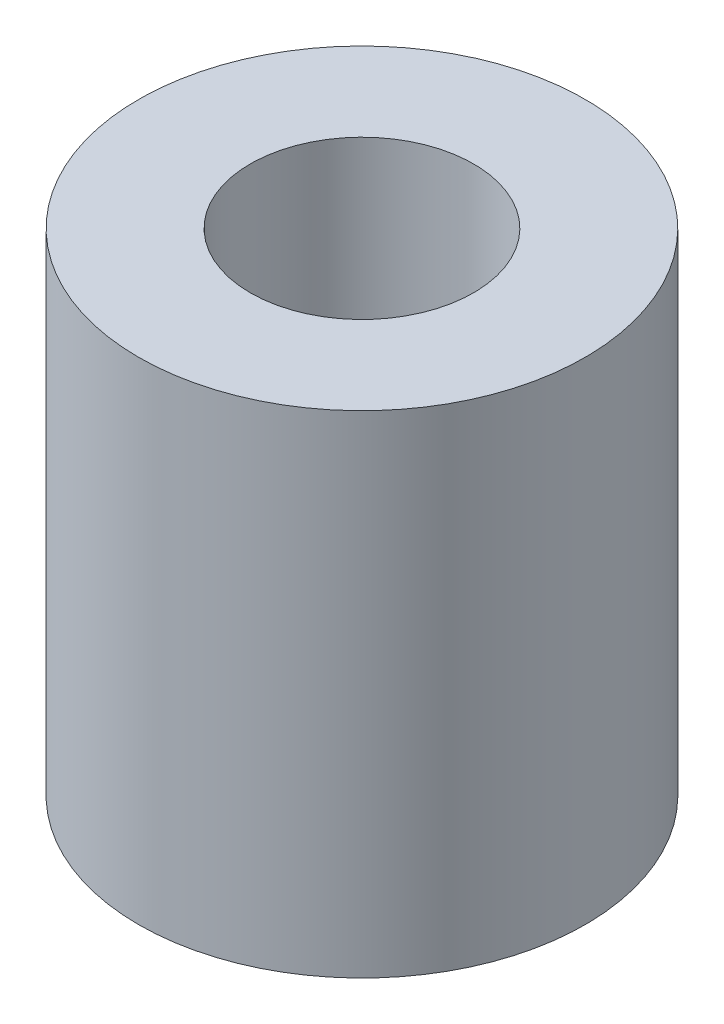
ISO-10303-21;
HEADER;
FILE_DESCRIPTION(('STEP AP214'),'2;1');
FILE_NAME('part.step','',(''),(''),'','','');
FILE_SCHEMA(('AUTOMOTIVE_DESIGN { 1 0 10303 214 1 1 1 1 }'));
ENDSEC;
DATA;
#1=APPLICATION_CONTEXT('core data for automotive mechanical design processes');
#2=APPLICATION_PROTOCOL_DEFINITION('international standard','automotive_design',2000,#1);
#3=PRODUCT_CONTEXT('',#1,'mechanical');
#4=PRODUCT('Part','Part','',(#3));
#5=PRODUCT_RELATED_PRODUCT_CATEGORY('part','',(#4));
#6=PRODUCT_DEFINITION_FORMATION('','',#4);
#7=PRODUCT_DEFINITION_CONTEXT('part definition',#1,'design');
#8=PRODUCT_DEFINITION('design','',#6,#7);
#9=PRODUCT_DEFINITION_SHAPE('','',#8);
#10=(LENGTH_UNIT() NAMED_UNIT(*) SI_UNIT(.MILLI.,.METRE.));
#11=(NAMED_UNIT(*) PLANE_ANGLE_UNIT() SI_UNIT($,.RADIAN.));
#12=(NAMED_UNIT(*) SI_UNIT($,.STERADIAN.) SOLID_ANGLE_UNIT());
#13=UNCERTAINTY_MEASURE_WITH_UNIT(LENGTH_MEASURE(1.E-05),#10,'distance_accuracy_value','');
#14=(GEOMETRIC_REPRESENTATION_CONTEXT(3) GLOBAL_UNCERTAINTY_ASSIGNED_CONTEXT((#13)) GLOBAL_UNIT_ASSIGNED_CONTEXT((#10,
#11,#12)) REPRESENTATION_CONTEXT('',''));
#15=CARTESIAN_POINT('',(0.,0.,0.));
#16=DIRECTION('',(0.,0.,1.));
#17=DIRECTION('',(1.,0.,0.));
#18=AXIS2_PLACEMENT_3D('',#15,#16,#17);
#19=CARTESIAN_POINT('',(0.,11.,0.));
#20=DIRECTION('',(0.,1.,0.));
#21=DIRECTION('',(0.,0.,1.));
#22=AXIS2_PLACEMENT_3D('',#19,#20,#21);
#23=PLANE('',#22);
#24=CARTESIAN_POINT('',(0.,11.,0.));
#25=DIRECTION('',(0.,1.,0.));
#26=DIRECTION('',(0.,0.,1.));
#27=AXIS2_PLACEMENT_3D('',#24,#25,#26);
#28=CIRCLE('',#27,5.);
#29=CARTESIAN_POINT('',(0.,11.,5.));
#30=VERTEX_POINT('',#29);
#31=EDGE_CURVE('E10',#30,#30,#28,.T.);
#32=ORIENTED_EDGE('',*,*,#31,.T.);
#33=EDGE_LOOP('',(#32));
#34=FACE_BOUND('',#33,.T.);
#35=CARTESIAN_POINT('',(0.,11.,0.));
#36=DIRECTION('',(0.,1.,0.));
#37=DIRECTION('',(0.,0.,1.));
#38=AXIS2_PLACEMENT_3D('',#35,#36,#37);
#39=CIRCLE('',#38,2.5);
#40=CARTESIAN_POINT('',(0.,11.,2.5));
#41=VERTEX_POINT('',#40);
#42=EDGE_CURVE('E42',#41,#41,#39,.T.);
#43=ORIENTED_EDGE('',*,*,#42,.F.);
#44=EDGE_LOOP('',(#43));
#45=FACE_BOUND('',#44,.T.);
#46=ADVANCED_FACE('F31',(#34,#45),#23,.T.);
#47=CARTESIAN_POINT('',(0.,0.,0.));
#48=DIRECTION('',(0.,1.,0.));
#49=DIRECTION('',(0.,0.,1.));
#50=AXIS2_PLACEMENT_3D('',#47,#48,#49);
#51=PLANE('',#50);
#52=CARTESIAN_POINT('',(0.,0.,0.));
#53=DIRECTION('',(0.,1.,0.));
#54=DIRECTION('',(0.,0.,1.));
#55=AXIS2_PLACEMENT_3D('',#52,#53,#54);
#56=CIRCLE('',#55,5.);
#57=CARTESIAN_POINT('',(0.,0.,5.));
#58=VERTEX_POINT('',#57);
#59=EDGE_CURVE('E35',#58,#58,#56,.T.);
#60=ORIENTED_EDGE('',*,*,#59,.F.);
#61=EDGE_LOOP('',(#60));
#62=FACE_BOUND('',#61,.T.);
#63=CARTESIAN_POINT('',(0.,0.,0.));
#64=DIRECTION('',(0.,1.,0.));
#65=DIRECTION('',(0.,0.,1.));
#66=AXIS2_PLACEMENT_3D('',#63,#64,#65);
#67=CIRCLE('',#66,2.5);
#68=CARTESIAN_POINT('',(0.,0.,2.5));
#69=VERTEX_POINT('',#68);
#70=EDGE_CURVE('E44',#69,#69,#67,.T.);
#71=ORIENTED_EDGE('',*,*,#70,.T.);
#72=EDGE_LOOP('',(#71));
#73=FACE_BOUND('',#72,.T.);
#74=ADVANCED_FACE('F54',(#62,#73),#51,.F.);
#75=CARTESIAN_POINT('',(0.,11.,0.));
#76=DIRECTION('',(0.,-1.,0.));
#77=DIRECTION('',(0.,0.,-1.));
#78=AXIS2_PLACEMENT_3D('',#75,#76,#77);
#79=CYLINDRICAL_SURFACE('',#78,5.);
#80=ORIENTED_EDGE('',*,*,#31,.F.);
#81=EDGE_LOOP('',(#80));
#82=FACE_BOUND('',#81,.T.);
#83=ORIENTED_EDGE('',*,*,#59,.T.);
#84=EDGE_LOOP('',(#83));
#85=FACE_BOUND('',#84,.T.);
#86=ADVANCED_FACE('F33',(#82,#85),#79,.T.);
#87=CARTESIAN_POINT('',(0.,11.,0.));
#88=DIRECTION('',(0.,-1.,0.));
#89=DIRECTION('',(0.,0.,-1.));
#90=AXIS2_PLACEMENT_3D('',#87,#88,#89);
#91=CYLINDRICAL_SURFACE('',#90,2.5);
#92=ORIENTED_EDGE('',*,*,#42,.T.);
#93=EDGE_LOOP('',(#92));
#94=FACE_BOUND('',#93,.T.);
#95=ORIENTED_EDGE('',*,*,#70,.F.);
#96=EDGE_LOOP('',(#95));
#97=FACE_BOUND('',#96,.T.);
#98=ADVANCED_FACE('F50',(#94,#97),#91,.F.);
#99=CLOSED_SHELL('',(#46,#74,#86,#98));
#100=MANIFOLD_SOLID_BREP('B2',#99);
#101=ADVANCED_BREP_SHAPE_REPRESENTATION('',(#18,#100),#14);
#102=SHAPE_DEFINITION_REPRESENTATION(#9,#101);
ENDSEC;
END-ISO-10303-21;
